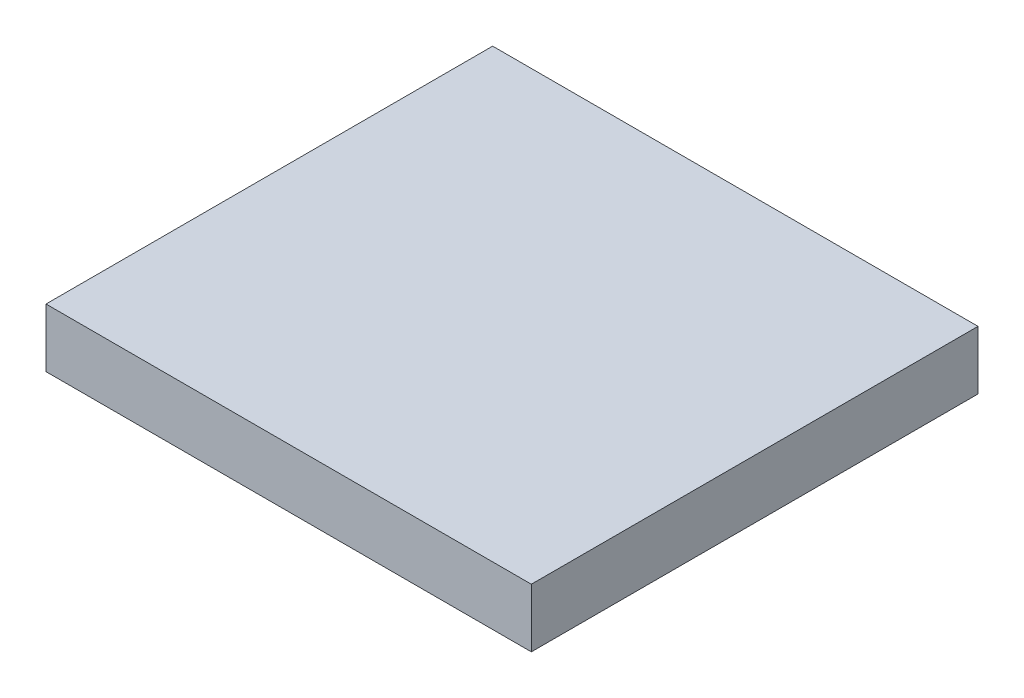
ISO-10303-21;
HEADER;
FILE_DESCRIPTION(('STEP AP214'),'2;1');
FILE_NAME('part.step','',(''),(''),'','','');
FILE_SCHEMA(('AUTOMOTIVE_DESIGN { 1 0 10303 214 1 1 1 1 }'));
ENDSEC;
DATA;
#1=APPLICATION_CONTEXT('core data for automotive mechanical design processes');
#2=APPLICATION_PROTOCOL_DEFINITION('international standard','automotive_design',2000,#1);
#3=PRODUCT_CONTEXT('',#1,'mechanical');
#4=PRODUCT('Part','Part','',(#3));
#5=PRODUCT_RELATED_PRODUCT_CATEGORY('part','',(#4));
#6=PRODUCT_DEFINITION_FORMATION('','',#4);
#7=PRODUCT_DEFINITION_CONTEXT('part definition',#1,'design');
#8=PRODUCT_DEFINITION('design','',#6,#7);
#9=PRODUCT_DEFINITION_SHAPE('','',#8);
#10=(LENGTH_UNIT() NAMED_UNIT(*) SI_UNIT(.MILLI.,.METRE.));
#11=(NAMED_UNIT(*) PLANE_ANGLE_UNIT() SI_UNIT($,.RADIAN.));
#12=(NAMED_UNIT(*) SI_UNIT($,.STERADIAN.) SOLID_ANGLE_UNIT());
#13=UNCERTAINTY_MEASURE_WITH_UNIT(LENGTH_MEASURE(1.E-05),#10,'distance_accuracy_value','');
#14=(GEOMETRIC_REPRESENTATION_CONTEXT(3) GLOBAL_UNCERTAINTY_ASSIGNED_CONTEXT((#13)) GLOBAL_UNIT_ASSIGNED_CONTEXT((#10,
#11,#12)) REPRESENTATION_CONTEXT('',''));
#15=CARTESIAN_POINT('',(0.,0.,0.));
#16=DIRECTION('',(0.,0.,1.));
#17=DIRECTION('',(1.,0.,0.));
#18=AXIS2_PLACEMENT_3D('',#15,#16,#17);
#19=CARTESIAN_POINT('',(0.,249.91241198,0.));
#20=DIRECTION('',(1.,0.,0.));
#21=DIRECTION('',(0.,0.,-1.));
#22=AXIS2_PLACEMENT_3D('',#19,#20,#21);
#23=PLANE('',#22);
#24=DIRECTION('',(0.,0.,1.));
#25=VECTOR('',#24,1.);
#26=CARTESIAN_POINT('',(0.,0.,0.));
#27=LINE('',#26,#25);
#28=CARTESIAN_POINT('',(0.,0.,-1905.));
#29=VERTEX_POINT('',#28);
#30=CARTESIAN_POINT('',(0.,0.,0.));
#31=VERTEX_POINT('',#30);
#32=EDGE_CURVE('E98',#29,#31,#27,.T.);
#33=ORIENTED_EDGE('',*,*,#32,.T.);
#34=DIRECTION('',(0.,-1.,0.));
#35=VECTOR('',#34,1.);
#36=CARTESIAN_POINT('',(0.,249.91241198,0.));
#37=LINE('',#36,#35);
#38=CARTESIAN_POINT('',(0.,249.91241198,0.));
#39=VERTEX_POINT('',#38);
#40=EDGE_CURVE('E11',#39,#31,#37,.T.);
#41=ORIENTED_EDGE('',*,*,#40,.F.);
#42=DIRECTION('',(0.,0.,1.));
#43=VECTOR('',#42,1.);
#44=CARTESIAN_POINT('',(0.,249.91241198,0.));
#45=LINE('',#44,#43);
#46=CARTESIAN_POINT('',(0.,249.91241198,-1905.));
#47=VERTEX_POINT('',#46);
#48=EDGE_CURVE('E86',#47,#39,#45,.T.);
#49=ORIENTED_EDGE('',*,*,#48,.F.);
#50=DIRECTION('',(0.,-1.,0.));
#51=VECTOR('',#50,1.);
#52=CARTESIAN_POINT('',(0.,249.91241198,-1905.));
#53=LINE('',#52,#51);
#54=EDGE_CURVE('E94',#47,#29,#53,.T.);
#55=ORIENTED_EDGE('',*,*,#54,.T.);
#56=EDGE_LOOP('',(#33,#41,#49,#55));
#57=FACE_BOUND('',#56,.T.);
#58=ADVANCED_FACE('F35',(#57),#23,.F.);
#59=CARTESIAN_POINT('',(0.,249.91241198,0.));
#60=DIRECTION('',(0.,0.,-1.));
#61=DIRECTION('',(-1.,0.,0.));
#62=AXIS2_PLACEMENT_3D('',#59,#60,#61);
#63=PLANE('',#62);
#64=DIRECTION('',(1.,0.,0.));
#65=VECTOR('',#64,1.);
#66=CARTESIAN_POINT('',(0.,0.,0.));
#67=LINE('',#66,#65);
#68=CARTESIAN_POINT('',(2070.,0.,0.));
#69=VERTEX_POINT('',#68);
#70=EDGE_CURVE('E90',#31,#69,#67,.T.);
#71=ORIENTED_EDGE('',*,*,#70,.T.);
#72=DIRECTION('',(0.,-1.,0.));
#73=VECTOR('',#72,1.);
#74=CARTESIAN_POINT('',(2070.,249.91241198,0.));
#75=LINE('',#74,#73);
#76=CARTESIAN_POINT('',(2070.,249.91241198,0.));
#77=VERTEX_POINT('',#76);
#78=EDGE_CURVE('E43',#77,#69,#75,.T.);
#79=ORIENTED_EDGE('',*,*,#78,.F.);
#80=DIRECTION('',(1.,0.,0.));
#81=VECTOR('',#80,1.);
#82=CARTESIAN_POINT('',(0.,249.91241198,0.));
#83=LINE('',#82,#81);
#84=EDGE_CURVE('E81',#39,#77,#83,.T.);
#85=ORIENTED_EDGE('',*,*,#84,.F.);
#86=ORIENTED_EDGE('',*,*,#40,.T.);
#87=EDGE_LOOP('',(#71,#79,#85,#86));
#88=FACE_BOUND('',#87,.T.);
#89=ADVANCED_FACE('F89',(#88),#63,.F.);
#90=CARTESIAN_POINT('',(2070.,249.91241198,0.));
#91=DIRECTION('',(-1.,0.,0.));
#92=DIRECTION('',(0.,0.,1.));
#93=AXIS2_PLACEMENT_3D('',#90,#91,#92);
#94=PLANE('',#93);
#95=DIRECTION('',(0.,0.,-1.));
#96=VECTOR('',#95,1.);
#97=CARTESIAN_POINT('',(2070.,0.,0.));
#98=LINE('',#97,#96);
#99=CARTESIAN_POINT('',(2070.,0.,-1905.));
#100=VERTEX_POINT('',#99);
#101=EDGE_CURVE('E68',#69,#100,#98,.T.);
#102=ORIENTED_EDGE('',*,*,#101,.T.);
#103=DIRECTION('',(0.,-1.,0.));
#104=VECTOR('',#103,1.);
#105=CARTESIAN_POINT('',(2070.,249.91241198,-1905.));
#106=LINE('',#105,#104);
#107=CARTESIAN_POINT('',(2070.,249.91241198,-1905.));
#108=VERTEX_POINT('',#107);
#109=EDGE_CURVE('E91',#108,#100,#106,.T.);
#110=ORIENTED_EDGE('',*,*,#109,.F.);
#111=DIRECTION('',(0.,0.,-1.));
#112=VECTOR('',#111,1.);
#113=CARTESIAN_POINT('',(2070.,249.91241198,0.));
#114=LINE('',#113,#112);
#115=EDGE_CURVE('E84',#77,#108,#114,.T.);
#116=ORIENTED_EDGE('',*,*,#115,.F.);
#117=ORIENTED_EDGE('',*,*,#78,.T.);
#118=EDGE_LOOP('',(#102,#110,#116,#117));
#119=FACE_BOUND('',#118,.T.);
#120=ADVANCED_FACE('F92',(#119),#94,.F.);
#121=CARTESIAN_POINT('',(0.,249.91241198,-1905.));
#122=DIRECTION('',(0.,0.,1.));
#123=DIRECTION('',(1.,0.,0.));
#124=AXIS2_PLACEMENT_3D('',#121,#122,#123);
#125=PLANE('',#124);
#126=DIRECTION('',(-1.,0.,0.));
#127=VECTOR('',#126,1.);
#128=CARTESIAN_POINT('',(0.,0.,-1905.));
#129=LINE('',#128,#127);
#130=EDGE_CURVE('E74',#100,#29,#129,.T.);
#131=ORIENTED_EDGE('',*,*,#130,.T.);
#132=ORIENTED_EDGE('',*,*,#54,.F.);
#133=DIRECTION('',(-1.,0.,0.));
#134=VECTOR('',#133,1.);
#135=CARTESIAN_POINT('',(0.,249.91241198,-1905.));
#136=LINE('',#135,#134);
#137=EDGE_CURVE('E51',#108,#47,#136,.T.);
#138=ORIENTED_EDGE('',*,*,#137,.F.);
#139=ORIENTED_EDGE('',*,*,#109,.T.);
#140=EDGE_LOOP('',(#131,#132,#138,#139));
#141=FACE_BOUND('',#140,.T.);
#142=ADVANCED_FACE('F105',(#141),#125,.F.);
#143=CARTESIAN_POINT('',(0.,249.91241198,0.));
#144=DIRECTION('',(0.,-1.,0.));
#145=DIRECTION('',(0.,0.,-1.));
#146=AXIS2_PLACEMENT_3D('',#143,#144,#145);
#147=PLANE('',#146);
#148=ORIENTED_EDGE('',*,*,#48,.T.);
#149=ORIENTED_EDGE('',*,*,#84,.T.);
#150=ORIENTED_EDGE('',*,*,#115,.T.);
#151=ORIENTED_EDGE('',*,*,#137,.T.);
#152=EDGE_LOOP('',(#148,#149,#150,#151));
#153=FACE_BOUND('',#152,.T.);
#154=ADVANCED_FACE('F82',(#153),#147,.F.);
#155=CARTESIAN_POINT('',(0.,0.,0.));
#156=DIRECTION('',(0.,-1.,0.));
#157=DIRECTION('',(0.,0.,-1.));
#158=AXIS2_PLACEMENT_3D('',#155,#156,#157);
#159=PLANE('',#158);
#160=ORIENTED_EDGE('',*,*,#32,.F.);
#161=ORIENTED_EDGE('',*,*,#130,.F.);
#162=ORIENTED_EDGE('',*,*,#101,.F.);
#163=ORIENTED_EDGE('',*,*,#70,.F.);
#164=EDGE_LOOP('',(#160,#161,#162,#163));
#165=FACE_BOUND('',#164,.T.);
#166=ADVANCED_FACE('F108',(#165),#159,.T.);
#167=CLOSED_SHELL('',(#58,#89,#120,#142,#154,#166));
#168=MANIFOLD_SOLID_BREP('B2',#167);
#169=ADVANCED_BREP_SHAPE_REPRESENTATION('',(#18,#168),#14);
#170=SHAPE_DEFINITION_REPRESENTATION(#9,#169);
ENDSEC;
END-ISO-10303-21;
